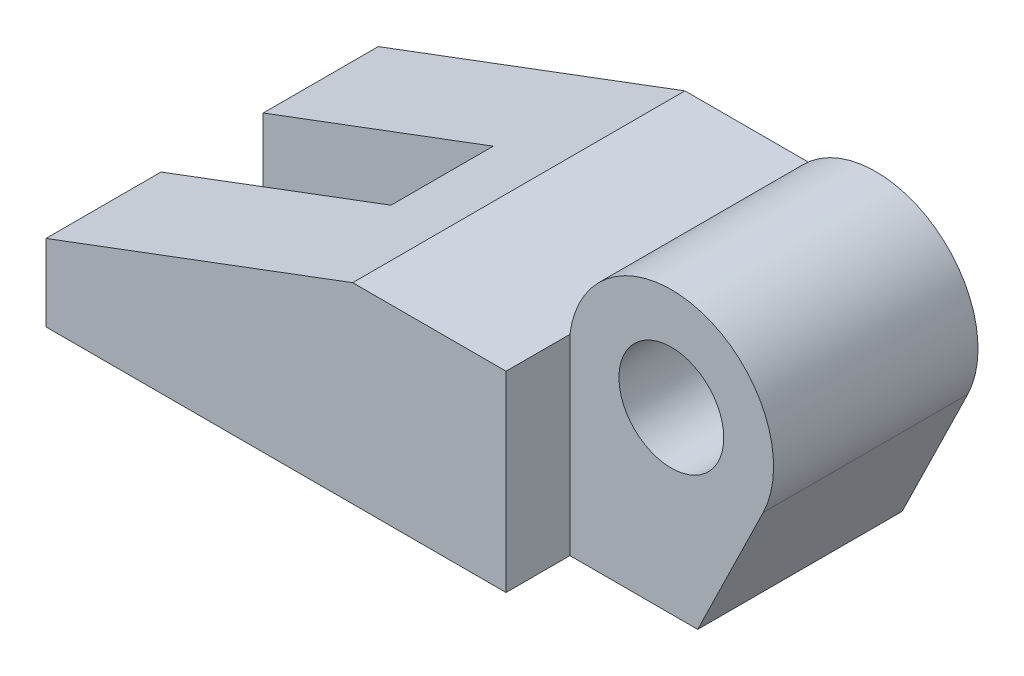
ISO-10303-21;
HEADER;
FILE_DESCRIPTION(('STEP AP214'),'2;1');
FILE_NAME('part.step','',(''),(''),'','','');
FILE_SCHEMA(('AUTOMOTIVE_DESIGN { 1 0 10303 214 1 1 1 1 }'));
ENDSEC;
DATA;
#1=APPLICATION_CONTEXT('core data for automotive mechanical design processes');
#2=APPLICATION_PROTOCOL_DEFINITION('international standard','automotive_design',2000,#1);
#3=PRODUCT_CONTEXT('',#1,'mechanical');
#4=PRODUCT('Part','Part','',(#3));
#5=PRODUCT_RELATED_PRODUCT_CATEGORY('part','',(#4));
#6=PRODUCT_DEFINITION_FORMATION('','',#4);
#7=PRODUCT_DEFINITION_CONTEXT('part definition',#1,'design');
#8=PRODUCT_DEFINITION('design','',#6,#7);
#9=PRODUCT_DEFINITION_SHAPE('','',#8);
#10=(LENGTH_UNIT() NAMED_UNIT(*) SI_UNIT(.MILLI.,.METRE.));
#11=(NAMED_UNIT(*) PLANE_ANGLE_UNIT() SI_UNIT($,.RADIAN.));
#12=(NAMED_UNIT(*) SI_UNIT($,.STERADIAN.) SOLID_ANGLE_UNIT());
#13=UNCERTAINTY_MEASURE_WITH_UNIT(LENGTH_MEASURE(1.E-05),#10,'distance_accuracy_value','');
#14=(GEOMETRIC_REPRESENTATION_CONTEXT(3) GLOBAL_UNCERTAINTY_ASSIGNED_CONTEXT((#13)) GLOBAL_UNIT_ASSIGNED_CONTEXT((#10,
#11,#12)) REPRESENTATION_CONTEXT('',''));
#15=CARTESIAN_POINT('',(0.,0.,0.));
#16=DIRECTION('',(0.,0.,1.));
#17=DIRECTION('',(1.,0.,0.));
#18=AXIS2_PLACEMENT_3D('',#15,#16,#17);
#19=CARTESIAN_POINT('',(18.,7.5,-13.));
#20=DIRECTION('',(1.,0.,0.));
#21=DIRECTION('',(0.,0.,-1.));
#22=AXIS2_PLACEMENT_3D('',#19,#20,#21);
#23=PLANE('',#22);
#24=DIRECTION('',(0.,0.,1.));
#25=VECTOR('',#24,1.);
#26=CARTESIAN_POINT('',(18.,7.5,-13.));
#27=LINE('',#26,#25);
#28=CARTESIAN_POINT('',(18.,7.5,-13.));
#29=VERTEX_POINT('',#28);
#30=CARTESIAN_POINT('',(18.,7.5,-8.));
#31=VERTEX_POINT('',#30);
#32=EDGE_CURVE('E134',#29,#31,#27,.T.);
#33=ORIENTED_EDGE('',*,*,#32,.T.);
#34=DIRECTION('',(0.,-1.,0.));
#35=VECTOR('',#34,1.);
#36=CARTESIAN_POINT('',(18.,7.5,-8.));
#37=LINE('',#36,#35);
#38=CARTESIAN_POINT('',(18.,-7.5,-8.));
#39=VERTEX_POINT('',#38);
#40=EDGE_CURVE('E55',#31,#39,#37,.T.);
#41=ORIENTED_EDGE('',*,*,#40,.T.);
#42=DIRECTION('',(0.,0.,1.));
#43=VECTOR('',#42,1.);
#44=CARTESIAN_POINT('',(18.,-7.5,-13.));
#45=LINE('',#44,#43);
#46=CARTESIAN_POINT('',(18.,-7.5,-13.));
#47=VERTEX_POINT('',#46);
#48=EDGE_CURVE('E220',#47,#39,#45,.T.);
#49=ORIENTED_EDGE('',*,*,#48,.F.);
#50=DIRECTION('',(0.,1.,0.));
#51=VECTOR('',#50,1.);
#52=CARTESIAN_POINT('',(18.,7.5,-13.));
#53=LINE('',#52,#51);
#54=EDGE_CURVE('E206',#47,#29,#53,.T.);
#55=ORIENTED_EDGE('',*,*,#54,.T.);
#56=EDGE_LOOP('',(#33,#41,#49,#55));
#57=FACE_BOUND('',#56,.T.);
#58=ADVANCED_FACE('F32',(#57),#23,.T.);
#59=CARTESIAN_POINT('',(-18.,-1.5,-13.));
#60=DIRECTION('',(-1.,0.,0.));
#61=DIRECTION('',(0.,-1.,0.));
#62=AXIS2_PLACEMENT_3D('',#59,#60,#61);
#63=PLANE('',#62);
#64=DIRECTION('',(0.,-1.,0.));
#65=VECTOR('',#64,1.);
#66=CARTESIAN_POINT('',(-18.,7.5,4.));
#67=LINE('',#66,#65);
#68=CARTESIAN_POINT('',(-18.,-1.5,4.));
#69=VERTEX_POINT('',#68);
#70=CARTESIAN_POINT('',(-18.,-7.5,4.));
#71=VERTEX_POINT('',#70);
#72=EDGE_CURVE('E186',#69,#71,#67,.T.);
#73=ORIENTED_EDGE('',*,*,#72,.T.);
#74=DIRECTION('',(0.,0.,1.));
#75=VECTOR('',#74,1.);
#76=CARTESIAN_POINT('',(-18.,-7.5,-13.));
#77=LINE('',#76,#75);
#78=CARTESIAN_POINT('',(-18.,-7.5,13.));
#79=VERTEX_POINT('',#78);
#80=EDGE_CURVE('E226',#71,#79,#77,.T.);
#81=ORIENTED_EDGE('',*,*,#80,.T.);
#82=DIRECTION('',(0.,-1.,0.));
#83=VECTOR('',#82,1.);
#84=CARTESIAN_POINT('',(-18.,-1.5,13.));
#85=LINE('',#84,#83);
#86=CARTESIAN_POINT('',(-18.,-1.5,13.));
#87=VERTEX_POINT('',#86);
#88=EDGE_CURVE('E200',#87,#79,#85,.T.);
#89=ORIENTED_EDGE('',*,*,#88,.F.);
#90=DIRECTION('',(0.,0.,1.));
#91=VECTOR('',#90,1.);
#92=CARTESIAN_POINT('',(-18.,-1.5,-13.));
#93=LINE('',#92,#91);
#94=EDGE_CURVE('E230',#69,#87,#93,.T.);
#95=ORIENTED_EDGE('',*,*,#94,.F.);
#96=EDGE_LOOP('',(#73,#81,#89,#95));
#97=FACE_BOUND('',#96,.T.);
#98=ADVANCED_FACE('F260',(#97),#63,.T.);
#99=DIRECTION('',(0.,-1.,0.));
#100=VECTOR('',#99,1.);
#101=CARTESIAN_POINT('',(18.,7.5,8.));
#102=LINE('',#101,#100);
#103=CARTESIAN_POINT('',(18.,7.5,8.));
#104=VERTEX_POINT('',#103);
#105=CARTESIAN_POINT('',(18.,-7.5,7.99999999999999));
#106=VERTEX_POINT('',#105);
#107=EDGE_CURVE('E137',#104,#106,#102,.T.);
#108=ORIENTED_EDGE('',*,*,#107,.F.);
#109=CARTESIAN_POINT('',(18.,7.5,13.));
#110=VERTEX_POINT('',#109);
#111=EDGE_CURVE('E127',#104,#110,#27,.T.);
#112=ORIENTED_EDGE('',*,*,#111,.T.);
#113=DIRECTION('',(0.,1.,0.));
#114=VECTOR('',#113,1.);
#115=CARTESIAN_POINT('',(18.,7.5,13.));
#116=LINE('',#115,#114);
#117=CARTESIAN_POINT('',(18.,-7.5,13.));
#118=VERTEX_POINT('',#117);
#119=EDGE_CURVE('E189',#118,#110,#116,.T.);
#120=ORIENTED_EDGE('',*,*,#119,.F.);
#121=EDGE_CURVE('E47',#106,#118,#45,.T.);
#122=ORIENTED_EDGE('',*,*,#121,.F.);
#123=EDGE_LOOP('',(#108,#112,#120,#122));
#124=FACE_BOUND('',#123,.T.);
#125=ADVANCED_FACE('F34',(#124),#23,.T.);
#126=CARTESIAN_POINT('',(-18.,-7.5,-13.));
#127=DIRECTION('',(0.,-1.,0.));
#128=DIRECTION('',(0.,0.,-1.));
#129=AXIS2_PLACEMENT_3D('',#126,#127,#128);
#130=PLANE('',#129);
#131=DIRECTION('',(-1.,0.,0.));
#132=VECTOR('',#131,1.);
#133=CARTESIAN_POINT('',(-18.,-7.5,4.));
#134=LINE('',#133,#132);
#135=CARTESIAN_POINT('',(0.,-7.5,4.));
#136=VERTEX_POINT('',#135);
#137=EDGE_CURVE('E183',#136,#71,#134,.T.);
#138=ORIENTED_EDGE('',*,*,#137,.F.);
#139=DIRECTION('',(0.,0.,1.));
#140=VECTOR('',#139,1.);
#141=CARTESIAN_POINT('',(0.,-7.5,-4.));
#142=LINE('',#141,#140);
#143=CARTESIAN_POINT('',(0.,-7.5,-4.));
#144=VERTEX_POINT('',#143);
#145=EDGE_CURVE('E180',#144,#136,#142,.T.);
#146=ORIENTED_EDGE('',*,*,#145,.F.);
#147=DIRECTION('',(1.,0.,0.));
#148=VECTOR('',#147,1.);
#149=CARTESIAN_POINT('',(-18.,-7.5,-4.));
#150=LINE('',#149,#148);
#151=CARTESIAN_POINT('',(-18.,-7.5,-4.));
#152=VERTEX_POINT('',#151);
#153=EDGE_CURVE('E176',#152,#144,#150,.T.);
#154=ORIENTED_EDGE('',*,*,#153,.F.);
#155=CARTESIAN_POINT('',(-18.,-7.5,-13.));
#156=VERTEX_POINT('',#155);
#157=EDGE_CURVE('E223',#156,#152,#77,.T.);
#158=ORIENTED_EDGE('',*,*,#157,.F.);
#159=DIRECTION('',(1.,0.,0.));
#160=VECTOR('',#159,1.);
#161=CARTESIAN_POINT('',(-18.,-7.5,-13.));
#162=LINE('',#161,#160);
#163=EDGE_CURVE('E135',#156,#47,#162,.T.);
#164=ORIENTED_EDGE('',*,*,#163,.T.);
#165=ORIENTED_EDGE('',*,*,#48,.T.);
#166=DIRECTION('',(1.,0.,0.));
#167=VECTOR('',#166,1.);
#168=CARTESIAN_POINT('',(18.,-7.5,-8.));
#169=LINE('',#168,#167);
#170=CARTESIAN_POINT('',(28.,-7.5,-8.));
#171=VERTEX_POINT('',#170);
#172=EDGE_CURVE('E169',#39,#171,#169,.T.);
#173=ORIENTED_EDGE('',*,*,#172,.T.);
#174=DIRECTION('',(0.,0.,1.));
#175=VECTOR('',#174,1.);
#176=CARTESIAN_POINT('',(28.,-7.5,-8.));
#177=LINE('',#176,#175);
#178=CARTESIAN_POINT('',(28.,-7.5,8.));
#179=VERTEX_POINT('',#178);
#180=EDGE_CURVE('E151',#171,#179,#177,.T.);
#181=ORIENTED_EDGE('',*,*,#180,.T.);
#182=DIRECTION('',(1.,0.,0.));
#183=VECTOR('',#182,1.);
#184=CARTESIAN_POINT('',(18.,-7.5,8.));
#185=LINE('',#184,#183);
#186=EDGE_CURVE('E142',#106,#179,#185,.T.);
#187=ORIENTED_EDGE('',*,*,#186,.F.);
#188=ORIENTED_EDGE('',*,*,#121,.T.);
#189=DIRECTION('',(1.,0.,0.));
#190=VECTOR('',#189,1.);
#191=CARTESIAN_POINT('',(-18.,-7.5,13.));
#192=LINE('',#191,#190);
#193=EDGE_CURVE('E203',#79,#118,#192,.T.);
#194=ORIENTED_EDGE('',*,*,#193,.F.);
#195=ORIENTED_EDGE('',*,*,#80,.F.);
#196=EDGE_LOOP('',(#138,#146,#154,#158,#164,#165,#173,#181,#187,#188,#194,#195));
#197=FACE_BOUND('',#196,.T.);
#198=ADVANCED_FACE('F252',(#197),#130,.T.);
#199=DIRECTION('',(0.,-1.,0.));
#200=VECTOR('',#199,1.);
#201=CARTESIAN_POINT('',(-18.,7.5,-4.));
#202=LINE('',#201,#200);
#203=CARTESIAN_POINT('',(-18.,-1.5,-4.));
#204=VERTEX_POINT('',#203);
#205=EDGE_CURVE('E185',#204,#152,#202,.T.);
#206=ORIENTED_EDGE('',*,*,#205,.F.);
#207=CARTESIAN_POINT('',(-18.,-1.5,-13.));
#208=VERTEX_POINT('',#207);
#209=EDGE_CURVE('E227',#208,#204,#93,.T.);
#210=ORIENTED_EDGE('',*,*,#209,.F.);
#211=DIRECTION('',(0.,-1.,0.));
#212=VECTOR('',#211,1.);
#213=CARTESIAN_POINT('',(-18.,-1.5,-13.));
#214=LINE('',#213,#212);
#215=EDGE_CURVE('E215',#208,#156,#214,.T.);
#216=ORIENTED_EDGE('',*,*,#215,.T.);
#217=ORIENTED_EDGE('',*,*,#157,.T.);
#218=EDGE_LOOP('',(#206,#210,#216,#217));
#219=FACE_BOUND('',#218,.T.);
#220=ADVANCED_FACE('F247',(#219),#63,.T.);
#221=CARTESIAN_POINT('',(-18.,-1.5,-13.));
#222=DIRECTION('',(-0.351123441588392,0.936329177569044,0.));
#223=DIRECTION('',(-0.936329177569045,-0.351123441588392,0.));
#224=AXIS2_PLACEMENT_3D('',#221,#222,#223);
#225=PLANE('',#224);
#226=DIRECTION('',(0.936329177569045,0.351123441588392,0.));
#227=VECTOR('',#226,1.);
#228=CARTESIAN_POINT('',(-18.,-1.5,4.));
#229=LINE('',#228,#227);
#230=CARTESIAN_POINT('',(0.,5.25,4.));
#231=VERTEX_POINT('',#230);
#232=EDGE_CURVE('E11',#69,#231,#229,.T.);
#233=ORIENTED_EDGE('',*,*,#232,.F.);
#234=ORIENTED_EDGE('',*,*,#94,.T.);
#235=DIRECTION('',(-0.936329177569044,-0.351123441588392,0.));
#236=VECTOR('',#235,1.);
#237=CARTESIAN_POINT('',(-18.,-1.5,13.));
#238=LINE('',#237,#236);
#239=CARTESIAN_POINT('',(6.,7.5,13.));
#240=VERTEX_POINT('',#239);
#241=EDGE_CURVE('E197',#240,#87,#238,.T.);
#242=ORIENTED_EDGE('',*,*,#241,.F.);
#243=DIRECTION('',(0.,0.,1.));
#244=VECTOR('',#243,1.);
#245=CARTESIAN_POINT('',(6.,7.5,-13.));
#246=LINE('',#245,#244);
#247=CARTESIAN_POINT('',(6.,7.5,-13.));
#248=VERTEX_POINT('',#247);
#249=EDGE_CURVE('E231',#248,#240,#246,.T.);
#250=ORIENTED_EDGE('',*,*,#249,.F.);
#251=DIRECTION('',(-0.936329177569044,-0.351123441588392,0.));
#252=VECTOR('',#251,1.);
#253=CARTESIAN_POINT('',(-18.,-1.5,-13.));
#254=LINE('',#253,#252);
#255=EDGE_CURVE('E212',#248,#208,#254,.T.);
#256=ORIENTED_EDGE('',*,*,#255,.T.);
#257=ORIENTED_EDGE('',*,*,#209,.T.);
#258=DIRECTION('',(-0.936329177569045,-0.351123441588392,0.));
#259=VECTOR('',#258,1.);
#260=CARTESIAN_POINT('',(-18.,-1.5,-4.));
#261=LINE('',#260,#259);
#262=CARTESIAN_POINT('',(0.,5.25,-4.));
#263=VERTEX_POINT('',#262);
#264=EDGE_CURVE('E222',#263,#204,#261,.T.);
#265=ORIENTED_EDGE('',*,*,#264,.F.);
#266=DIRECTION('',(0.,0.,-1.));
#267=VECTOR('',#266,1.);
#268=CARTESIAN_POINT('',(0.,5.25,-13.));
#269=LINE('',#268,#267);
#270=EDGE_CURVE('E40',#231,#263,#269,.T.);
#271=ORIENTED_EDGE('',*,*,#270,.F.);
#272=EDGE_LOOP('',(#233,#234,#242,#250,#256,#257,#265,#271));
#273=FACE_BOUND('',#272,.T.);
#274=ADVANCED_FACE('F241',(#273),#225,.T.);
#275=CARTESIAN_POINT('',(6.,7.5,-13.));
#276=DIRECTION('',(0.,1.,0.));
#277=DIRECTION('',(0.,0.,1.));
#278=AXIS2_PLACEMENT_3D('',#275,#276,#277);
#279=PLANE('',#278);
#280=ORIENTED_EDGE('',*,*,#249,.T.);
#281=DIRECTION('',(-1.,0.,0.));
#282=VECTOR('',#281,1.);
#283=CARTESIAN_POINT('',(6.,7.5,13.));
#284=LINE('',#283,#282);
#285=EDGE_CURVE('E132',#110,#240,#284,.T.);
#286=ORIENTED_EDGE('',*,*,#285,.F.);
#287=ORIENTED_EDGE('',*,*,#111,.F.);
#288=DIRECTION('',(0.,0.,1.));
#289=VECTOR('',#288,1.);
#290=CARTESIAN_POINT('',(18.,7.5,-8.));
#291=LINE('',#290,#289);
#292=EDGE_CURVE('E130',#31,#104,#291,.T.);
#293=ORIENTED_EDGE('',*,*,#292,.F.);
#294=ORIENTED_EDGE('',*,*,#32,.F.);
#295=DIRECTION('',(-1.,0.,0.));
#296=VECTOR('',#295,1.);
#297=CARTESIAN_POINT('',(6.,7.5,-13.));
#298=LINE('',#297,#296);
#299=EDGE_CURVE('E209',#29,#248,#298,.T.);
#300=ORIENTED_EDGE('',*,*,#299,.T.);
#301=EDGE_LOOP('',(#280,#286,#287,#293,#294,#300));
#302=FACE_BOUND('',#301,.T.);
#303=ADVANCED_FACE('F128',(#302),#279,.T.);
#304=CARTESIAN_POINT('',(0.,0.,-13.));
#305=DIRECTION('',(0.,0.,1.));
#306=DIRECTION('',(1.,0.,0.));
#307=AXIS2_PLACEMENT_3D('',#304,#305,#306);
#308=PLANE('',#307);
#309=ORIENTED_EDGE('',*,*,#54,.F.);
#310=ORIENTED_EDGE('',*,*,#163,.F.);
#311=ORIENTED_EDGE('',*,*,#215,.F.);
#312=ORIENTED_EDGE('',*,*,#255,.F.);
#313=ORIENTED_EDGE('',*,*,#299,.F.);
#314=EDGE_LOOP('',(#309,#310,#311,#312,#313));
#315=FACE_BOUND('',#314,.T.);
#316=ADVANCED_FACE('F274',(#315),#308,.F.);
#317=CARTESIAN_POINT('',(0.,0.,13.));
#318=DIRECTION('',(0.,0.,1.));
#319=DIRECTION('',(1.,0.,0.));
#320=AXIS2_PLACEMENT_3D('',#317,#318,#319);
#321=PLANE('',#320);
#322=ORIENTED_EDGE('',*,*,#119,.T.);
#323=ORIENTED_EDGE('',*,*,#285,.T.);
#324=ORIENTED_EDGE('',*,*,#241,.T.);
#325=ORIENTED_EDGE('',*,*,#88,.T.);
#326=ORIENTED_EDGE('',*,*,#193,.T.);
#327=EDGE_LOOP('',(#322,#323,#324,#325,#326));
#328=FACE_BOUND('',#327,.T.);
#329=ADVANCED_FACE('F264',(#328),#321,.T.);
#330=CARTESIAN_POINT('',(-18.,7.5,4.));
#331=DIRECTION('',(0.,0.,1.));
#332=DIRECTION('',(1.,0.,0.));
#333=AXIS2_PLACEMENT_3D('',#330,#331,#332);
#334=PLANE('',#333);
#335=ORIENTED_EDGE('',*,*,#232,.T.);
#336=DIRECTION('',(0.,-1.,0.));
#337=VECTOR('',#336,1.);
#338=CARTESIAN_POINT('',(0.,7.5,4.));
#339=LINE('',#338,#337);
#340=EDGE_CURVE('E190',#231,#136,#339,.T.);
#341=ORIENTED_EDGE('',*,*,#340,.T.);
#342=ORIENTED_EDGE('',*,*,#137,.T.);
#343=ORIENTED_EDGE('',*,*,#72,.F.);
#344=EDGE_LOOP('',(#335,#341,#342,#343));
#345=FACE_BOUND('',#344,.T.);
#346=ADVANCED_FACE('F257',(#345),#334,.F.);
#347=CARTESIAN_POINT('',(0.,7.5,-4.));
#348=DIRECTION('',(1.,0.,0.));
#349=DIRECTION('',(0.,0.,-1.));
#350=AXIS2_PLACEMENT_3D('',#347,#348,#349);
#351=PLANE('',#350);
#352=ORIENTED_EDGE('',*,*,#270,.T.);
#353=DIRECTION('',(0.,-1.,0.));
#354=VECTOR('',#353,1.);
#355=CARTESIAN_POINT('',(0.,7.5,-4.));
#356=LINE('',#355,#354);
#357=EDGE_CURVE('E192',#263,#144,#356,.T.);
#358=ORIENTED_EDGE('',*,*,#357,.T.);
#359=ORIENTED_EDGE('',*,*,#145,.T.);
#360=ORIENTED_EDGE('',*,*,#340,.F.);
#361=EDGE_LOOP('',(#352,#358,#359,#360));
#362=FACE_BOUND('',#361,.T.);
#363=ADVANCED_FACE('F238',(#362),#351,.F.);
#364=CARTESIAN_POINT('',(-18.,7.5,-4.));
#365=DIRECTION('',(0.,0.,-1.));
#366=DIRECTION('',(-1.,0.,0.));
#367=AXIS2_PLACEMENT_3D('',#364,#365,#366);
#368=PLANE('',#367);
#369=ORIENTED_EDGE('',*,*,#264,.T.);
#370=ORIENTED_EDGE('',*,*,#205,.T.);
#371=ORIENTED_EDGE('',*,*,#153,.T.);
#372=ORIENTED_EDGE('',*,*,#357,.F.);
#373=EDGE_LOOP('',(#369,#370,#371,#372));
#374=FACE_BOUND('',#373,.T.);
#375=ADVANCED_FACE('F244',(#374),#368,.F.);
#376=CARTESIAN_POINT('',(25.9372539331938,6.5,-8.));
#377=DIRECTION('',(0.,0.,1.));
#378=DIRECTION('',(1.,0.,0.));
#379=AXIS2_PLACEMENT_3D('',#376,#377,#378);
#380=CYLINDRICAL_SURFACE('',#379,8.);
#381=ORIENTED_EDGE('',*,*,#292,.T.);
#382=CARTESIAN_POINT('',(25.9372539331938,6.5,8.));
#383=DIRECTION('',(0.,0.,1.));
#384=DIRECTION('',(1.,0.,0.));
#385=AXIS2_PLACEMENT_3D('',#382,#383,#384);
#386=CIRCLE('',#385,8.);
#387=CARTESIAN_POINT('',(33.1249550502556,2.98760015775699,8.));
#388=VERTEX_POINT('',#387);
#389=EDGE_CURVE('E143',#388,#104,#386,.T.);
#390=ORIENTED_EDGE('',*,*,#389,.F.);
#391=DIRECTION('',(0.,0.,1.));
#392=VECTOR('',#391,1.);
#393=CARTESIAN_POINT('',(33.1249550502556,2.98760015775699,-8.));
#394=LINE('',#393,#392);
#395=CARTESIAN_POINT('',(33.1249550502556,2.98760015775699,-8.));
#396=VERTEX_POINT('',#395);
#397=EDGE_CURVE('E174',#396,#388,#394,.T.);
#398=ORIENTED_EDGE('',*,*,#397,.F.);
#399=CARTESIAN_POINT('',(25.9372539331938,6.5,-8.));
#400=DIRECTION('',(0.,0.,1.));
#401=DIRECTION('',(1.,0.,0.));
#402=AXIS2_PLACEMENT_3D('',#399,#400,#401);
#403=CIRCLE('',#402,8.);
#404=EDGE_CURVE('E150',#396,#31,#403,.T.);
#405=ORIENTED_EDGE('',*,*,#404,.T.);
#406=EDGE_LOOP('',(#381,#390,#398,#405));
#407=FACE_BOUND('',#406,.T.);
#408=ADVANCED_FACE('F148',(#407),#380,.T.);
#409=CARTESIAN_POINT('',(28.,-7.5,-8.));
#410=DIRECTION('',(0.898462639632724,-0.439049980280376,0.));
#411=DIRECTION('',(0.439049980280376,0.898462639632724,0.));
#412=AXIS2_PLACEMENT_3D('',#409,#410,#411);
#413=PLANE('',#412);
#414=ORIENTED_EDGE('',*,*,#397,.T.);
#415=DIRECTION('',(0.439049980280376,0.898462639632724,0.));
#416=VECTOR('',#415,1.);
#417=CARTESIAN_POINT('',(28.,-7.5,8.));
#418=LINE('',#417,#416);
#419=EDGE_CURVE('E157',#179,#388,#418,.T.);
#420=ORIENTED_EDGE('',*,*,#419,.F.);
#421=ORIENTED_EDGE('',*,*,#180,.F.);
#422=DIRECTION('',(0.439049980280376,0.898462639632724,0.));
#423=VECTOR('',#422,1.);
#424=CARTESIAN_POINT('',(28.,-7.5,-8.));
#425=LINE('',#424,#423);
#426=EDGE_CURVE('E152',#171,#396,#425,.T.);
#427=ORIENTED_EDGE('',*,*,#426,.T.);
#428=EDGE_LOOP('',(#414,#420,#421,#427));
#429=FACE_BOUND('',#428,.T.);
#430=ADVANCED_FACE('F266',(#429),#413,.T.);
#431=CARTESIAN_POINT('',(25.9372539331938,6.5,-8.));
#432=DIRECTION('',(0.,0.,1.));
#433=DIRECTION('',(1.,0.,0.));
#434=AXIS2_PLACEMENT_3D('',#431,#432,#433);
#435=PLANE('',#434);
#436=CARTESIAN_POINT('',(25.9372539331938,6.5,-8.));
#437=DIRECTION('',(0.,0.,1.));
#438=DIRECTION('',(1.,0.,0.));
#439=AXIS2_PLACEMENT_3D('',#436,#437,#438);
#440=CIRCLE('',#439,4.1);
#441=CARTESIAN_POINT('',(30.0372539331938,6.5,-8.));
#442=VERTEX_POINT('',#441);
#443=EDGE_CURVE('E158',#442,#442,#440,.T.);
#444=ORIENTED_EDGE('',*,*,#443,.T.);
#445=EDGE_LOOP('',(#444));
#446=FACE_BOUND('',#445,.T.);
#447=ORIENTED_EDGE('',*,*,#404,.F.);
#448=ORIENTED_EDGE('',*,*,#426,.F.);
#449=ORIENTED_EDGE('',*,*,#172,.F.);
#450=ORIENTED_EDGE('',*,*,#40,.F.);
#451=EDGE_LOOP('',(#447,#448,#449,#450));
#452=FACE_BOUND('',#451,.T.);
#453=ADVANCED_FACE('F269',(#446,#452),#435,.F.);
#454=CARTESIAN_POINT('',(25.9372539331938,6.5,8.));
#455=DIRECTION('',(0.,0.,1.));
#456=DIRECTION('',(1.,0.,0.));
#457=AXIS2_PLACEMENT_3D('',#454,#455,#456);
#458=PLANE('',#457);
#459=CARTESIAN_POINT('',(25.9372539331938,6.5,8.));
#460=DIRECTION('',(0.,0.,1.));
#461=DIRECTION('',(1.,0.,0.));
#462=AXIS2_PLACEMENT_3D('',#459,#460,#461);
#463=CIRCLE('',#462,4.1);
#464=CARTESIAN_POINT('',(30.0372539331938,6.5,8.));
#465=VERTEX_POINT('',#464);
#466=EDGE_CURVE('E161',#465,#465,#463,.T.);
#467=ORIENTED_EDGE('',*,*,#466,.F.);
#468=EDGE_LOOP('',(#467));
#469=FACE_BOUND('',#468,.T.);
#470=ORIENTED_EDGE('',*,*,#389,.T.);
#471=ORIENTED_EDGE('',*,*,#107,.T.);
#472=ORIENTED_EDGE('',*,*,#186,.T.);
#473=ORIENTED_EDGE('',*,*,#419,.T.);
#474=EDGE_LOOP('',(#470,#471,#472,#473));
#475=FACE_BOUND('',#474,.T.);
#476=ADVANCED_FACE('F155',(#469,#475),#458,.T.);
#477=CARTESIAN_POINT('',(25.9372539331938,6.5,-13.));
#478=DIRECTION('',(0.,0.,1.));
#479=DIRECTION('',(1.,0.,0.));
#480=AXIS2_PLACEMENT_3D('',#477,#478,#479);
#481=CYLINDRICAL_SURFACE('',#480,4.1);
#482=ORIENTED_EDGE('',*,*,#466,.T.);
#483=EDGE_LOOP('',(#482));
#484=FACE_BOUND('',#483,.T.);
#485=ORIENTED_EDGE('',*,*,#443,.F.);
#486=EDGE_LOOP('',(#485));
#487=FACE_BOUND('',#486,.T.);
#488=ADVANCED_FACE('F345',(#484,#487),#481,.F.);
#489=CLOSED_SHELL('',(#58,#98,#125,#198,#220,#274,#303,#316,#329,#346,#363,#375,#408,#430,#453,
#476,#488));
#490=MANIFOLD_SOLID_BREP('B2',#489);
#491=ADVANCED_BREP_SHAPE_REPRESENTATION('',(#18,#490),#14);
#492=SHAPE_DEFINITION_REPRESENTATION(#9,#491);
ENDSEC;
END-ISO-10303-21;
